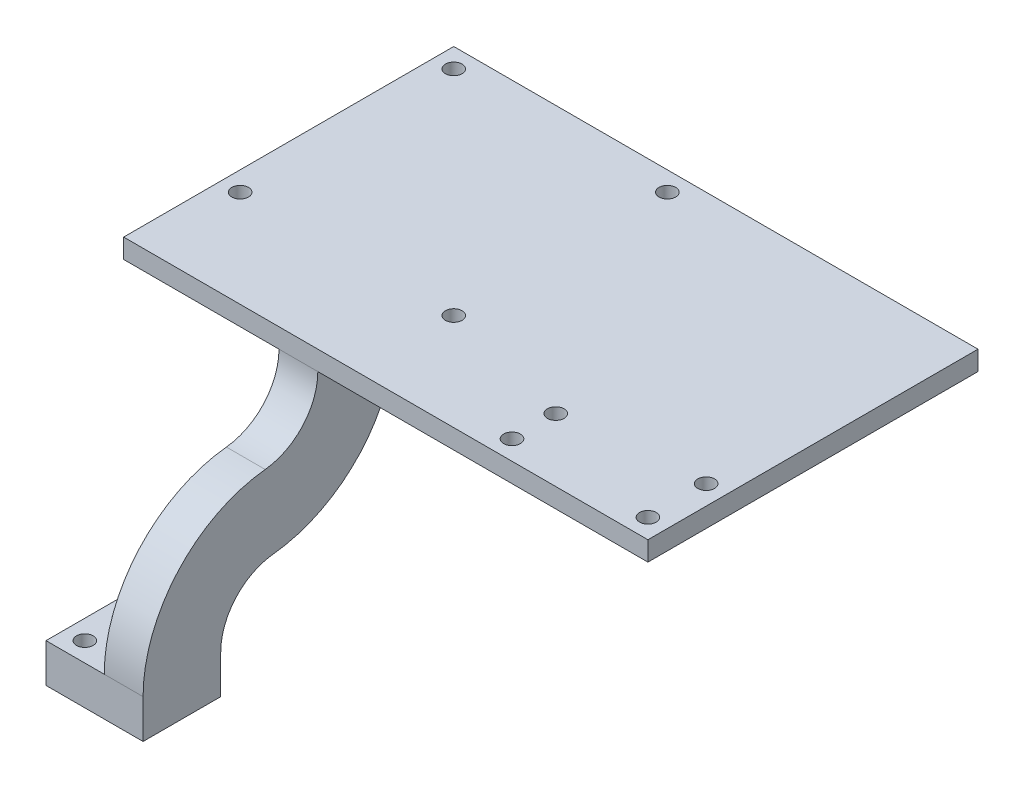
ISO-10303-21;
HEADER;
FILE_DESCRIPTION(('STEP AP214'),'2;1');
FILE_NAME('part.step','',(''),(''),'','','');
FILE_SCHEMA(('AUTOMOTIVE_DESIGN { 1 0 10303 214 1 1 1 1 }'));
ENDSEC;
DATA;
#1=APPLICATION_CONTEXT('core data for automotive mechanical design processes');
#2=APPLICATION_PROTOCOL_DEFINITION('international standard','automotive_design',2000,#1);
#3=PRODUCT_CONTEXT('',#1,'mechanical');
#4=PRODUCT('Part','Part','',(#3));
#5=PRODUCT_RELATED_PRODUCT_CATEGORY('part','',(#4));
#6=PRODUCT_DEFINITION_FORMATION('','',#4);
#7=PRODUCT_DEFINITION_CONTEXT('part definition',#1,'design');
#8=PRODUCT_DEFINITION('design','',#6,#7);
#9=PRODUCT_DEFINITION_SHAPE('','',#8);
#10=(LENGTH_UNIT() NAMED_UNIT(*) SI_UNIT(.MILLI.,.METRE.));
#11=(NAMED_UNIT(*) PLANE_ANGLE_UNIT() SI_UNIT($,.RADIAN.));
#12=(NAMED_UNIT(*) SI_UNIT($,.STERADIAN.) SOLID_ANGLE_UNIT());
#13=UNCERTAINTY_MEASURE_WITH_UNIT(LENGTH_MEASURE(1.E-05),#10,'distance_accuracy_value','');
#14=(GEOMETRIC_REPRESENTATION_CONTEXT(3) GLOBAL_UNCERTAINTY_ASSIGNED_CONTEXT((#13)) GLOBAL_UNIT_ASSIGNED_CONTEXT((#10,
#11,#12)) REPRESENTATION_CONTEXT('',''));
#15=CARTESIAN_POINT('',(0.,0.,0.));
#16=DIRECTION('',(0.,0.,1.));
#17=DIRECTION('',(1.,0.,0.));
#18=AXIS2_PLACEMENT_3D('',#15,#16,#17);
#19=CARTESIAN_POINT('',(10.,-10.,10.));
#20=DIRECTION('',(0.,1.,0.));
#21=DIRECTION('',(0.,0.,1.));
#22=AXIS2_PLACEMENT_3D('',#19,#20,#21);
#23=PLANE('',#22);
#24=CARTESIAN_POINT('',(-10.,-10.,-5.));
#25=DIRECTION('',(0.,1.,0.));
#26=DIRECTION('',(0.,0.,1.));
#27=AXIS2_PLACEMENT_3D('',#24,#25,#26);
#28=CIRCLE('',#27,2.15265);
#29=CARTESIAN_POINT('',(-10.,-10.,-2.84735));
#30=VERTEX_POINT('',#29);
#31=EDGE_CURVE('E234',#30,#30,#28,.T.);
#32=ORIENTED_EDGE('',*,*,#31,.T.);
#33=EDGE_LOOP('',(#32));
#34=FACE_BOUND('',#33,.T.);
#35=CARTESIAN_POINT('',(-10.,-10.,5.));
#36=DIRECTION('',(0.,1.,0.));
#37=DIRECTION('',(0.,0.,1.));
#38=AXIS2_PLACEMENT_3D('',#35,#36,#37);
#39=CIRCLE('',#38,2.15265);
#40=CARTESIAN_POINT('',(-10.,-10.,7.15265));
#41=VERTEX_POINT('',#40);
#42=EDGE_CURVE('E168',#41,#41,#39,.T.);
#43=ORIENTED_EDGE('',*,*,#42,.T.);
#44=EDGE_LOOP('',(#43));
#45=FACE_BOUND('',#44,.T.);
#46=DIRECTION('',(-1.,0.,0.));
#47=VECTOR('',#46,1.);
#48=CARTESIAN_POINT('',(10.,-10.,10.));
#49=LINE('',#48,#47);
#50=CARTESIAN_POINT('',(10.,-10.,10.));
#51=VERTEX_POINT('',#50);
#52=CARTESIAN_POINT('',(-15.,-10.,10.));
#53=VERTEX_POINT('',#52);
#54=EDGE_CURVE('E114',#51,#53,#49,.T.);
#55=ORIENTED_EDGE('',*,*,#54,.T.);
#56=DIRECTION('',(0.,0.,-1.));
#57=VECTOR('',#56,1.);
#58=CARTESIAN_POINT('',(-15.,-10.,10.));
#59=LINE('',#58,#57);
#60=CARTESIAN_POINT('',(-15.,-10.,-10.));
#61=VERTEX_POINT('',#60);
#62=EDGE_CURVE('E161',#53,#61,#59,.T.);
#63=ORIENTED_EDGE('',*,*,#62,.T.);
#64=DIRECTION('',(-1.,0.,0.));
#65=VECTOR('',#64,1.);
#66=CARTESIAN_POINT('',(10.,-10.,-10.));
#67=LINE('',#66,#65);
#68=CARTESIAN_POINT('',(10.,-10.,-10.));
#69=VERTEX_POINT('',#68);
#70=EDGE_CURVE('E45',#69,#61,#67,.T.);
#71=ORIENTED_EDGE('',*,*,#70,.F.);
#72=DIRECTION('',(0.,0.,-1.));
#73=VECTOR('',#72,1.);
#74=CARTESIAN_POINT('',(10.,-10.,10.));
#75=LINE('',#74,#73);
#76=EDGE_CURVE('E130',#51,#69,#75,.T.);
#77=ORIENTED_EDGE('',*,*,#76,.F.);
#78=EDGE_LOOP('',(#55,#63,#71,#77));
#79=FACE_BOUND('',#78,.T.);
#80=ADVANCED_FACE('F37',(#34,#45,#79),#23,.F.);
#81=CARTESIAN_POINT('',(10.,-10.,-10.));
#82=DIRECTION('',(0.,0.,1.));
#83=DIRECTION('',(0.,-1.,0.));
#84=AXIS2_PLACEMENT_3D('',#81,#82,#83);
#85=PLANE('',#84);
#86=ORIENTED_EDGE('',*,*,#70,.T.);
#87=DIRECTION('',(0.,1.,0.));
#88=VECTOR('',#87,1.);
#89=CARTESIAN_POINT('',(-15.,-10.,-10.));
#90=LINE('',#89,#88);
#91=CARTESIAN_POINT('',(-15.,0.,-10.));
#92=VERTEX_POINT('',#91);
#93=EDGE_CURVE('E150',#61,#92,#90,.T.);
#94=ORIENTED_EDGE('',*,*,#93,.T.);
#95=DIRECTION('',(1.,0.,0.));
#96=VECTOR('',#95,1.);
#97=CARTESIAN_POINT('',(-15.,0.,-10.));
#98=LINE('',#97,#96);
#99=CARTESIAN_POINT('',(0.,0.,-10.));
#100=VERTEX_POINT('',#99);
#101=EDGE_CURVE('E173',#92,#100,#98,.T.);
#102=ORIENTED_EDGE('',*,*,#101,.T.);
#103=DIRECTION('',(-1.,0.,0.));
#104=VECTOR('',#103,1.);
#105=CARTESIAN_POINT('',(10.,0.,-10.));
#106=LINE('',#105,#104);
#107=CARTESIAN_POINT('',(10.,0.,-10.));
#108=VERTEX_POINT('',#107);
#109=EDGE_CURVE('E141',#108,#100,#106,.T.);
#110=ORIENTED_EDGE('',*,*,#109,.F.);
#111=DIRECTION('',(0.,1.,0.));
#112=VECTOR('',#111,1.);
#113=CARTESIAN_POINT('',(10.,-10.,-10.));
#114=LINE('',#113,#112);
#115=EDGE_CURVE('E81',#69,#108,#114,.T.);
#116=ORIENTED_EDGE('',*,*,#115,.F.);
#117=EDGE_LOOP('',(#86,#94,#102,#110,#116));
#118=FACE_BOUND('',#117,.T.);
#119=ADVANCED_FACE('F147',(#118),#85,.F.);
#120=CARTESIAN_POINT('',(10.,0.,-25.1388888888889));
#121=DIRECTION('',(-1.,0.,0.));
#122=DIRECTION('',(0.,0.,1.));
#123=AXIS2_PLACEMENT_3D('',#120,#121,#122);
#124=CYLINDRICAL_SURFACE('',#123,15.1388888888889);
#125=CARTESIAN_POINT('',(0.,0.,-25.1388888888889));
#126=DIRECTION('',(-1.,0.,0.));
#127=DIRECTION('',(0.,0.,1.));
#128=AXIS2_PLACEMENT_3D('',#125,#126,#127);
#129=CIRCLE('',#128,15.1388888888889);
#130=CARTESIAN_POINT('',(0.,15.0552486187845,-23.5497237569061));
#131=VERTEX_POINT('',#130);
#132=EDGE_CURVE('E118',#100,#131,#129,.T.);
#133=ORIENTED_EDGE('',*,*,#132,.T.);
#134=DIRECTION('',(-1.,0.,0.));
#135=VECTOR('',#134,1.);
#136=CARTESIAN_POINT('',(10.,15.0552486187845,-23.5497237569061));
#137=LINE('',#136,#135);
#138=CARTESIAN_POINT('',(10.,15.0552486187845,-23.5497237569061));
#139=VERTEX_POINT('',#138);
#140=EDGE_CURVE('E138',#139,#131,#137,.T.);
#141=ORIENTED_EDGE('',*,*,#140,.F.);
#142=CARTESIAN_POINT('',(10.,0.,-25.1388888888889));
#143=DIRECTION('',(-1.,0.,0.));
#144=DIRECTION('',(0.,0.,1.));
#145=AXIS2_PLACEMENT_3D('',#142,#143,#144);
#146=CIRCLE('',#145,15.1388888888889);
#147=EDGE_CURVE('E179',#108,#139,#146,.T.);
#148=ORIENTED_EDGE('',*,*,#147,.F.);
#149=ORIENTED_EDGE('',*,*,#109,.T.);
#150=EDGE_LOOP('',(#133,#141,#148,#149));
#151=FACE_BOUND('',#150,.T.);
#152=ADVANCED_FACE('F266',(#151),#124,.F.);
#153=CARTESIAN_POINT('',(10.,50.,-19.8611111111111));
#154=DIRECTION('',(-1.,0.,0.));
#155=DIRECTION('',(0.,0.,1.));
#156=AXIS2_PLACEMENT_3D('',#153,#154,#155);
#157=CYLINDRICAL_SURFACE('',#156,35.1388888888889);
#158=CARTESIAN_POINT('',(0.,50.,-19.8611111111111));
#159=DIRECTION('',(1.,0.,0.));
#160=DIRECTION('',(0.,0.,-1.));
#161=AXIS2_PLACEMENT_3D('',#158,#159,#160);
#162=CIRCLE('',#161,35.1388888888889);
#163=CARTESIAN_POINT('',(0.,50.,-55.));
#164=VERTEX_POINT('',#163);
#165=EDGE_CURVE('E120',#131,#164,#162,.T.);
#166=ORIENTED_EDGE('',*,*,#165,.T.);
#167=DIRECTION('',(-1.,0.,0.));
#168=VECTOR('',#167,1.);
#169=CARTESIAN_POINT('',(10.,50.,-55.));
#170=LINE('',#169,#168);
#171=CARTESIAN_POINT('',(10.,50.,-55.));
#172=VERTEX_POINT('',#171);
#173=EDGE_CURVE('E135',#172,#164,#170,.T.);
#174=ORIENTED_EDGE('',*,*,#173,.F.);
#175=CARTESIAN_POINT('',(10.,50.,-19.8611111111111));
#176=DIRECTION('',(1.,0.,0.));
#177=DIRECTION('',(0.,0.,-1.));
#178=AXIS2_PLACEMENT_3D('',#175,#176,#177);
#179=CIRCLE('',#178,35.1388888888889);
#180=EDGE_CURVE('E181',#139,#172,#179,.T.);
#181=ORIENTED_EDGE('',*,*,#180,.F.);
#182=ORIENTED_EDGE('',*,*,#140,.T.);
#183=EDGE_LOOP('',(#166,#174,#181,#182));
#184=FACE_BOUND('',#183,.T.);
#185=ADVANCED_FACE('F187',(#184),#157,.T.);
#186=CARTESIAN_POINT('',(10.,50.,-19.8611111111111));
#187=DIRECTION('',(-1.,0.,0.));
#188=DIRECTION('',(0.,0.,1.));
#189=AXIS2_PLACEMENT_3D('',#186,#187,#188);
#190=CYLINDRICAL_SURFACE('',#189,15.1388888888889);
#191=CARTESIAN_POINT('',(0.,50.,-19.8611111111111));
#192=DIRECTION('',(-1.,0.,0.));
#193=DIRECTION('',(0.,0.,-1.));
#194=AXIS2_PLACEMENT_3D('',#191,#192,#193);
#195=CIRCLE('',#194,15.1388888888889);
#196=CARTESIAN_POINT('',(0.,50.,-35.));
#197=VERTEX_POINT('',#196);
#198=CARTESIAN_POINT('',(0.,34.9447513812155,-21.4502762430939));
#199=VERTEX_POINT('',#198);
#200=EDGE_CURVE('E72',#197,#199,#195,.T.);
#201=ORIENTED_EDGE('',*,*,#200,.T.);
#202=DIRECTION('',(-1.,0.,0.));
#203=VECTOR('',#202,1.);
#204=CARTESIAN_POINT('',(10.,34.9447513812155,-21.4502762430939));
#205=LINE('',#204,#203);
#206=CARTESIAN_POINT('',(10.,34.9447513812155,-21.4502762430939));
#207=VERTEX_POINT('',#206);
#208=EDGE_CURVE('E104',#207,#199,#205,.T.);
#209=ORIENTED_EDGE('',*,*,#208,.F.);
#210=CARTESIAN_POINT('',(10.,50.,-19.8611111111111));
#211=DIRECTION('',(-1.,0.,0.));
#212=DIRECTION('',(0.,0.,-1.));
#213=AXIS2_PLACEMENT_3D('',#210,#211,#212);
#214=CIRCLE('',#213,15.1388888888889);
#215=CARTESIAN_POINT('',(10.,50.,-35.));
#216=VERTEX_POINT('',#215);
#217=EDGE_CURVE('E95',#216,#207,#214,.T.);
#218=ORIENTED_EDGE('',*,*,#217,.F.);
#219=DIRECTION('',(-1.,0.,0.));
#220=VECTOR('',#219,1.);
#221=CARTESIAN_POINT('',(10.,50.,-35.));
#222=LINE('',#221,#220);
#223=EDGE_CURVE('E68',#216,#197,#222,.T.);
#224=ORIENTED_EDGE('',*,*,#223,.T.);
#225=EDGE_LOOP('',(#201,#209,#218,#224));
#226=FACE_BOUND('',#225,.T.);
#227=ADVANCED_FACE('F105',(#226),#190,.F.);
#228=CARTESIAN_POINT('',(10.,0.,-25.1388888888889));
#229=DIRECTION('',(-1.,0.,0.));
#230=DIRECTION('',(0.,0.,1.));
#231=AXIS2_PLACEMENT_3D('',#228,#229,#230);
#232=CYLINDRICAL_SURFACE('',#231,35.1388888888889);
#233=CARTESIAN_POINT('',(0.,0.,-25.1388888888889));
#234=DIRECTION('',(1.,0.,0.));
#235=DIRECTION('',(0.,0.,1.));
#236=AXIS2_PLACEMENT_3D('',#233,#234,#235);
#237=CIRCLE('',#236,35.1388888888889);
#238=CARTESIAN_POINT('',(0.,0.,10.));
#239=VERTEX_POINT('',#238);
#240=EDGE_CURVE('E128',#199,#239,#237,.T.);
#241=ORIENTED_EDGE('',*,*,#240,.T.);
#242=DIRECTION('',(-1.,0.,0.));
#243=VECTOR('',#242,1.);
#244=CARTESIAN_POINT('',(10.,0.,10.));
#245=LINE('',#244,#243);
#246=CARTESIAN_POINT('',(10.,0.,10.));
#247=VERTEX_POINT('',#246);
#248=EDGE_CURVE('E109',#247,#239,#245,.T.);
#249=ORIENTED_EDGE('',*,*,#248,.F.);
#250=CARTESIAN_POINT('',(10.,0.,-25.1388888888889));
#251=DIRECTION('',(1.,0.,0.));
#252=DIRECTION('',(0.,0.,1.));
#253=AXIS2_PLACEMENT_3D('',#250,#251,#252);
#254=CIRCLE('',#253,35.1388888888889);
#255=EDGE_CURVE('E98',#207,#247,#254,.T.);
#256=ORIENTED_EDGE('',*,*,#255,.F.);
#257=ORIENTED_EDGE('',*,*,#208,.T.);
#258=EDGE_LOOP('',(#241,#249,#256,#257));
#259=FACE_BOUND('',#258,.T.);
#260=ADVANCED_FACE('F111',(#259),#232,.T.);
#261=CARTESIAN_POINT('',(10.,0.,10.));
#262=DIRECTION('',(0.,0.,-1.));
#263=DIRECTION('',(-1.,0.,0.));
#264=AXIS2_PLACEMENT_3D('',#261,#262,#263);
#265=PLANE('',#264);
#266=ORIENTED_EDGE('',*,*,#248,.T.);
#267=DIRECTION('',(1.,0.,0.));
#268=VECTOR('',#267,1.);
#269=CARTESIAN_POINT('',(-15.,0.,10.));
#270=LINE('',#269,#268);
#271=CARTESIAN_POINT('',(-15.,0.,10.));
#272=VERTEX_POINT('',#271);
#273=EDGE_CURVE('E121',#272,#239,#270,.T.);
#274=ORIENTED_EDGE('',*,*,#273,.F.);
#275=DIRECTION('',(0.,-1.,0.));
#276=VECTOR('',#275,1.);
#277=CARTESIAN_POINT('',(-15.,-10.,10.));
#278=LINE('',#277,#276);
#279=EDGE_CURVE('E166',#272,#53,#278,.T.);
#280=ORIENTED_EDGE('',*,*,#279,.T.);
#281=ORIENTED_EDGE('',*,*,#54,.F.);
#282=DIRECTION('',(0.,-1.,0.));
#283=VECTOR('',#282,1.);
#284=CARTESIAN_POINT('',(10.,0.,10.));
#285=LINE('',#284,#283);
#286=EDGE_CURVE('E53',#247,#51,#285,.T.);
#287=ORIENTED_EDGE('',*,*,#286,.F.);
#288=EDGE_LOOP('',(#266,#274,#280,#281,#287));
#289=FACE_BOUND('',#288,.T.);
#290=ADVANCED_FACE('F264',(#289),#265,.F.);
#291=CARTESIAN_POINT('',(10.,0.,-25.1388888888889));
#292=DIRECTION('',(-1.,0.,0.));
#293=DIRECTION('',(0.,0.,1.));
#294=AXIS2_PLACEMENT_3D('',#291,#292,#293);
#295=PLANE('',#294);
#296=ORIENTED_EDGE('',*,*,#255,.T.);
#297=ORIENTED_EDGE('',*,*,#286,.T.);
#298=ORIENTED_EDGE('',*,*,#76,.T.);
#299=ORIENTED_EDGE('',*,*,#115,.T.);
#300=ORIENTED_EDGE('',*,*,#147,.T.);
#301=ORIENTED_EDGE('',*,*,#180,.T.);
#302=DIRECTION('',(0.,0.,1.));
#303=VECTOR('',#302,1.);
#304=CARTESIAN_POINT('',(10.,50.,-55.));
#305=LINE('',#304,#303);
#306=EDGE_CURVE('E101',#172,#216,#305,.T.);
#307=ORIENTED_EDGE('',*,*,#306,.T.);
#308=ORIENTED_EDGE('',*,*,#217,.T.);
#309=EDGE_LOOP('',(#296,#297,#298,#299,#300,#301,#307,#308));
#310=FACE_BOUND('',#309,.T.);
#311=ADVANCED_FACE('F96',(#310),#295,.F.);
#312=CARTESIAN_POINT('',(0.,0.,-25.1388888888889));
#313=DIRECTION('',(-1.,0.,0.));
#314=DIRECTION('',(0.,0.,1.));
#315=AXIS2_PLACEMENT_3D('',#312,#313,#314);
#316=PLANE('',#315);
#317=DIRECTION('',(0.,0.,-1.));
#318=VECTOR('',#317,1.);
#319=CARTESIAN_POINT('',(0.,0.,-25.1388888888889));
#320=LINE('',#319,#318);
#321=EDGE_CURVE('E11',#239,#100,#320,.T.);
#322=ORIENTED_EDGE('',*,*,#321,.F.);
#323=ORIENTED_EDGE('',*,*,#240,.F.);
#324=ORIENTED_EDGE('',*,*,#200,.F.);
#325=DIRECTION('',(0.,0.,1.));
#326=VECTOR('',#325,1.);
#327=CARTESIAN_POINT('',(0.,50.,-55.));
#328=LINE('',#327,#326);
#329=EDGE_CURVE('E124',#164,#197,#328,.T.);
#330=ORIENTED_EDGE('',*,*,#329,.F.);
#331=ORIENTED_EDGE('',*,*,#165,.F.);
#332=ORIENTED_EDGE('',*,*,#132,.F.);
#333=EDGE_LOOP('',(#322,#323,#324,#330,#331,#332));
#334=FACE_BOUND('',#333,.T.);
#335=ADVANCED_FACE('F253',(#334),#316,.T.);
#336=CARTESIAN_POINT('',(-15.,0.,10.));
#337=DIRECTION('',(0.,1.,0.));
#338=DIRECTION('',(0.,0.,1.));
#339=AXIS2_PLACEMENT_3D('',#336,#337,#338);
#340=PLANE('',#339);
#341=CARTESIAN_POINT('',(-10.,0.,-5.));
#342=DIRECTION('',(0.,1.,0.));
#343=DIRECTION('',(0.,0.,1.));
#344=AXIS2_PLACEMENT_3D('',#341,#342,#343);
#345=CIRCLE('',#344,2.15264999999999);
#346=CARTESIAN_POINT('',(-10.,0.,-2.84735000000001));
#347=VERTEX_POINT('',#346);
#348=EDGE_CURVE('E231',#347,#347,#345,.T.);
#349=ORIENTED_EDGE('',*,*,#348,.F.);
#350=EDGE_LOOP('',(#349));
#351=FACE_BOUND('',#350,.T.);
#352=CARTESIAN_POINT('',(-10.,0.,5.));
#353=DIRECTION('',(0.,1.,0.));
#354=DIRECTION('',(0.,0.,1.));
#355=AXIS2_PLACEMENT_3D('',#352,#353,#354);
#356=CIRCLE('',#355,2.15264999999999);
#357=CARTESIAN_POINT('',(-10.,0.,7.15264999999999));
#358=VERTEX_POINT('',#357);
#359=EDGE_CURVE('E237',#358,#358,#356,.T.);
#360=ORIENTED_EDGE('',*,*,#359,.F.);
#361=EDGE_LOOP('',(#360));
#362=FACE_BOUND('',#361,.T.);
#363=ORIENTED_EDGE('',*,*,#273,.T.);
#364=ORIENTED_EDGE('',*,*,#321,.T.);
#365=ORIENTED_EDGE('',*,*,#101,.F.);
#366=DIRECTION('',(0.,0.,1.));
#367=VECTOR('',#366,1.);
#368=CARTESIAN_POINT('',(-15.,0.,10.));
#369=LINE('',#368,#367);
#370=EDGE_CURVE('E164',#92,#272,#369,.T.);
#371=ORIENTED_EDGE('',*,*,#370,.T.);
#372=EDGE_LOOP('',(#363,#364,#365,#371));
#373=FACE_BOUND('',#372,.T.);
#374=ADVANCED_FACE('F250',(#351,#362,#373),#340,.T.);
#375=CARTESIAN_POINT('',(-15.,0.,0.));
#376=DIRECTION('',(-1.,0.,0.));
#377=DIRECTION('',(0.,0.,1.));
#378=AXIS2_PLACEMENT_3D('',#375,#376,#377);
#379=PLANE('',#378);
#380=ORIENTED_EDGE('',*,*,#279,.F.);
#381=ORIENTED_EDGE('',*,*,#370,.F.);
#382=ORIENTED_EDGE('',*,*,#93,.F.);
#383=ORIENTED_EDGE('',*,*,#62,.F.);
#384=EDGE_LOOP('',(#380,#381,#382,#383));
#385=FACE_BOUND('',#384,.T.);
#386=ADVANCED_FACE('F160',(#385),#379,.T.);
#387=CARTESIAN_POINT('',(-10.,0.,5.));
#388=DIRECTION('',(0.,1.,0.));
#389=DIRECTION('',(0.,0.,1.));
#390=AXIS2_PLACEMENT_3D('',#387,#388,#389);
#391=CYLINDRICAL_SURFACE('',#390,2.15264999999999);
#392=ORIENTED_EDGE('',*,*,#42,.F.);
#393=EDGE_LOOP('',(#392));
#394=FACE_BOUND('',#393,.T.);
#395=ORIENTED_EDGE('',*,*,#359,.T.);
#396=EDGE_LOOP('',(#395));
#397=FACE_BOUND('',#396,.T.);
#398=ADVANCED_FACE('F243',(#394,#397),#391,.F.);
#399=CARTESIAN_POINT('',(-10.,0.,-5.));
#400=DIRECTION('',(0.,1.,0.));
#401=DIRECTION('',(0.,0.,1.));
#402=AXIS2_PLACEMENT_3D('',#399,#400,#401);
#403=CYLINDRICAL_SURFACE('',#402,2.15264999999999);
#404=ORIENTED_EDGE('',*,*,#31,.F.);
#405=EDGE_LOOP('',(#404));
#406=FACE_BOUND('',#405,.T.);
#407=ORIENTED_EDGE('',*,*,#348,.T.);
#408=EDGE_LOOP('',(#407));
#409=FACE_BOUND('',#408,.T.);
#410=ADVANCED_FACE('F246',(#406,#409),#403,.F.);
#411=CARTESIAN_POINT('',(0.,50.,0.));
#412=DIRECTION('',(0.,1.,0.));
#413=DIRECTION('',(0.,0.,1.));
#414=AXIS2_PLACEMENT_3D('',#411,#412,#413);
#415=PLANE('',#414);
#416=CARTESIAN_POINT('',(90.,50.,-40.));
#417=DIRECTION('',(0.,1.,0.));
#418=DIRECTION('',(0.,0.,1.));
#419=AXIS2_PLACEMENT_3D('',#416,#417,#418);
#420=CIRCLE('',#419,2.15265);
#421=CARTESIAN_POINT('',(90.,50.,-37.84735));
#422=VERTEX_POINT('',#421);
#423=EDGE_CURVE('E351',#422,#422,#420,.T.);
#424=ORIENTED_EDGE('',*,*,#423,.T.);
#425=EDGE_LOOP('',(#424));
#426=FACE_BOUND('',#425,.T.);
#427=CARTESIAN_POINT('',(55.,50.,-40.));
#428=DIRECTION('',(0.,1.,0.));
#429=DIRECTION('',(0.,0.,1.));
#430=AXIS2_PLACEMENT_3D('',#427,#428,#429);
#431=CIRCLE('',#430,2.15265);
#432=CARTESIAN_POINT('',(55.,50.,-37.84735));
#433=VERTEX_POINT('',#432);
#434=EDGE_CURVE('E345',#433,#433,#431,.T.);
#435=ORIENTED_EDGE('',*,*,#434,.T.);
#436=EDGE_LOOP('',(#435));
#437=FACE_BOUND('',#436,.T.);
#438=CARTESIAN_POINT('',(55.,50.,-51.2660634139274));
#439=DIRECTION('',(0.,1.,0.));
#440=DIRECTION('',(0.,0.,1.));
#441=AXIS2_PLACEMENT_3D('',#438,#439,#440);
#442=CIRCLE('',#441,2.15265);
#443=CARTESIAN_POINT('',(55.,50.,-49.1134134139274));
#444=VERTEX_POINT('',#443);
#445=EDGE_CURVE('E339',#444,#444,#442,.T.);
#446=ORIENTED_EDGE('',*,*,#445,.T.);
#447=EDGE_LOOP('',(#446));
#448=FACE_BOUND('',#447,.T.);
#449=CARTESIAN_POINT('',(90.,50.,-55.));
#450=DIRECTION('',(0.,1.,0.));
#451=DIRECTION('',(0.,0.,1.));
#452=AXIS2_PLACEMENT_3D('',#449,#450,#451);
#453=CIRCLE('',#452,2.15265);
#454=CARTESIAN_POINT('',(90.,50.,-52.84735));
#455=VERTEX_POINT('',#454);
#456=EDGE_CURVE('E333',#455,#455,#453,.T.);
#457=ORIENTED_EDGE('',*,*,#456,.T.);
#458=EDGE_LOOP('',(#457));
#459=FACE_BOUND('',#458,.T.);
#460=CARTESIAN_POINT('',(20.,50.,-115.));
#461=DIRECTION('',(0.,1.,0.));
#462=DIRECTION('',(0.,0.,1.));
#463=AXIS2_PLACEMENT_3D('',#460,#461,#462);
#464=CIRCLE('',#463,2.15265);
#465=CARTESIAN_POINT('',(20.,50.,-112.84735));
#466=VERTEX_POINT('',#465);
#467=EDGE_CURVE('E327',#466,#466,#464,.T.);
#468=ORIENTED_EDGE('',*,*,#467,.T.);
#469=EDGE_LOOP('',(#468));
#470=FACE_BOUND('',#469,.T.);
#471=CARTESIAN_POINT('',(20.,50.,-60.));
#472=DIRECTION('',(0.,1.,0.));
#473=DIRECTION('',(0.,0.,1.));
#474=AXIS2_PLACEMENT_3D('',#471,#472,#473);
#475=CIRCLE('',#474,2.15265);
#476=CARTESIAN_POINT('',(20.,50.,-57.84735));
#477=VERTEX_POINT('',#476);
#478=EDGE_CURVE('E321',#477,#477,#475,.T.);
#479=ORIENTED_EDGE('',*,*,#478,.T.);
#480=EDGE_LOOP('',(#479));
#481=FACE_BOUND('',#480,.T.);
#482=CARTESIAN_POINT('',(-35.,50.,-60.));
#483=DIRECTION('',(0.,1.,0.));
#484=DIRECTION('',(0.,0.,1.));
#485=AXIS2_PLACEMENT_3D('',#482,#483,#484);
#486=CIRCLE('',#485,2.15265);
#487=CARTESIAN_POINT('',(-35.,50.,-57.84735));
#488=VERTEX_POINT('',#487);
#489=EDGE_CURVE('E315',#488,#488,#486,.T.);
#490=ORIENTED_EDGE('',*,*,#489,.T.);
#491=EDGE_LOOP('',(#490));
#492=FACE_BOUND('',#491,.T.);
#493=CARTESIAN_POINT('',(-35.,50.,-115.));
#494=DIRECTION('',(0.,1.,0.));
#495=DIRECTION('',(0.,0.,1.));
#496=AXIS2_PLACEMENT_3D('',#493,#494,#495);
#497=CIRCLE('',#496,2.15265);
#498=CARTESIAN_POINT('',(-35.,50.,-112.84735));
#499=VERTEX_POINT('',#498);
#500=EDGE_CURVE('E305',#499,#499,#497,.T.);
#501=ORIENTED_EDGE('',*,*,#500,.T.);
#502=EDGE_LOOP('',(#501));
#503=FACE_BOUND('',#502,.T.);
#504=ORIENTED_EDGE('',*,*,#173,.T.);
#505=ORIENTED_EDGE('',*,*,#329,.T.);
#506=DIRECTION('',(1.,0.,0.));
#507=VECTOR('',#506,1.);
#508=CARTESIAN_POINT('',(95.,50.,-35.));
#509=LINE('',#508,#507);
#510=CARTESIAN_POINT('',(-40.,50.,-35.));
#511=VERTEX_POINT('',#510);
#512=EDGE_CURVE('E202',#511,#197,#509,.T.);
#513=ORIENTED_EDGE('',*,*,#512,.F.);
#514=DIRECTION('',(0.,0.,1.));
#515=VECTOR('',#514,1.);
#516=CARTESIAN_POINT('',(-40.,50.,-35.));
#517=LINE('',#516,#515);
#518=CARTESIAN_POINT('',(-40.,50.,-120.));
#519=VERTEX_POINT('',#518);
#520=EDGE_CURVE('E203',#519,#511,#517,.T.);
#521=ORIENTED_EDGE('',*,*,#520,.F.);
#522=DIRECTION('',(-1.,0.,0.));
#523=VECTOR('',#522,1.);
#524=CARTESIAN_POINT('',(95.,50.,-120.));
#525=LINE('',#524,#523);
#526=CARTESIAN_POINT('',(95.,50.,-120.));
#527=VERTEX_POINT('',#526);
#528=EDGE_CURVE('E304',#527,#519,#525,.T.);
#529=ORIENTED_EDGE('',*,*,#528,.F.);
#530=DIRECTION('',(0.,0.,-1.));
#531=VECTOR('',#530,1.);
#532=CARTESIAN_POINT('',(95.,50.,-35.));
#533=LINE('',#532,#531);
#534=CARTESIAN_POINT('',(95.,50.,-35.));
#535=VERTEX_POINT('',#534);
#536=EDGE_CURVE('E198',#535,#527,#533,.T.);
#537=ORIENTED_EDGE('',*,*,#536,.F.);
#538=EDGE_CURVE('E194',#216,#535,#509,.T.);
#539=ORIENTED_EDGE('',*,*,#538,.F.);
#540=ORIENTED_EDGE('',*,*,#306,.F.);
#541=EDGE_LOOP('',(#504,#505,#513,#521,#529,#537,#539,#540));
#542=FACE_BOUND('',#541,.T.);
#543=ADVANCED_FACE('F191',(#426,#437,#448,#459,#470,#481,#492,#503,#542),#415,.F.);
#544=CARTESIAN_POINT('',(95.,55.,-35.));
#545=DIRECTION('',(-1.,0.,0.));
#546=DIRECTION('',(0.,0.,1.));
#547=AXIS2_PLACEMENT_3D('',#544,#545,#546);
#548=PLANE('',#547);
#549=ORIENTED_EDGE('',*,*,#536,.T.);
#550=DIRECTION('',(0.,-1.,0.));
#551=VECTOR('',#550,1.);
#552=CARTESIAN_POINT('',(95.,55.,-120.));
#553=LINE('',#552,#551);
#554=CARTESIAN_POINT('',(95.,55.,-120.));
#555=VERTEX_POINT('',#554);
#556=EDGE_CURVE('E228',#555,#527,#553,.T.);
#557=ORIENTED_EDGE('',*,*,#556,.F.);
#558=DIRECTION('',(0.,0.,-1.));
#559=VECTOR('',#558,1.);
#560=CARTESIAN_POINT('',(95.,55.,-35.));
#561=LINE('',#560,#559);
#562=CARTESIAN_POINT('',(95.,55.,-35.));
#563=VERTEX_POINT('',#562);
#564=EDGE_CURVE('E214',#563,#555,#561,.T.);
#565=ORIENTED_EDGE('',*,*,#564,.F.);
#566=DIRECTION('',(0.,-1.,0.));
#567=VECTOR('',#566,1.);
#568=CARTESIAN_POINT('',(95.,55.,-35.));
#569=LINE('',#568,#567);
#570=EDGE_CURVE('E221',#563,#535,#569,.T.);
#571=ORIENTED_EDGE('',*,*,#570,.T.);
#572=EDGE_LOOP('',(#549,#557,#565,#571));
#573=FACE_BOUND('',#572,.T.);
#574=ADVANCED_FACE('F303',(#573),#548,.F.);
#575=CARTESIAN_POINT('',(95.,55.,-120.));
#576=DIRECTION('',(0.,0.,1.));
#577=DIRECTION('',(1.,0.,0.));
#578=AXIS2_PLACEMENT_3D('',#575,#576,#577);
#579=PLANE('',#578);
#580=ORIENTED_EDGE('',*,*,#528,.T.);
#581=DIRECTION('',(0.,-1.,0.));
#582=VECTOR('',#581,1.);
#583=CARTESIAN_POINT('',(-40.,55.,-120.));
#584=LINE('',#583,#582);
#585=CARTESIAN_POINT('',(-40.,55.,-120.));
#586=VERTEX_POINT('',#585);
#587=EDGE_CURVE('E225',#586,#519,#584,.T.);
#588=ORIENTED_EDGE('',*,*,#587,.F.);
#589=DIRECTION('',(-1.,0.,0.));
#590=VECTOR('',#589,1.);
#591=CARTESIAN_POINT('',(95.,55.,-120.));
#592=LINE('',#591,#590);
#593=EDGE_CURVE('E216',#555,#586,#592,.T.);
#594=ORIENTED_EDGE('',*,*,#593,.F.);
#595=ORIENTED_EDGE('',*,*,#556,.T.);
#596=EDGE_LOOP('',(#580,#588,#594,#595));
#597=FACE_BOUND('',#596,.T.);
#598=ADVANCED_FACE('F294',(#597),#579,.F.);
#599=CARTESIAN_POINT('',(-40.,55.,-35.));
#600=DIRECTION('',(1.,0.,0.));
#601=DIRECTION('',(0.,0.,-1.));
#602=AXIS2_PLACEMENT_3D('',#599,#600,#601);
#603=PLANE('',#602);
#604=ORIENTED_EDGE('',*,*,#520,.T.);
#605=DIRECTION('',(0.,-1.,0.));
#606=VECTOR('',#605,1.);
#607=CARTESIAN_POINT('',(-40.,55.,-35.));
#608=LINE('',#607,#606);
#609=CARTESIAN_POINT('',(-40.,55.,-35.));
#610=VERTEX_POINT('',#609);
#611=EDGE_CURVE('E212',#610,#511,#608,.T.);
#612=ORIENTED_EDGE('',*,*,#611,.F.);
#613=DIRECTION('',(0.,0.,1.));
#614=VECTOR('',#613,1.);
#615=CARTESIAN_POINT('',(-40.,55.,-35.));
#616=LINE('',#615,#614);
#617=EDGE_CURVE('E298',#586,#610,#616,.T.);
#618=ORIENTED_EDGE('',*,*,#617,.F.);
#619=ORIENTED_EDGE('',*,*,#587,.T.);
#620=EDGE_LOOP('',(#604,#612,#618,#619));
#621=FACE_BOUND('',#620,.T.);
#622=ADVANCED_FACE('F426',(#621),#603,.F.);
#623=CARTESIAN_POINT('',(95.,55.,-35.));
#624=DIRECTION('',(0.,0.,-1.));
#625=DIRECTION('',(-1.,0.,0.));
#626=AXIS2_PLACEMENT_3D('',#623,#624,#625);
#627=PLANE('',#626);
#628=ORIENTED_EDGE('',*,*,#512,.T.);
#629=ORIENTED_EDGE('',*,*,#223,.F.);
#630=ORIENTED_EDGE('',*,*,#538,.T.);
#631=ORIENTED_EDGE('',*,*,#570,.F.);
#632=DIRECTION('',(1.,0.,0.));
#633=VECTOR('',#632,1.);
#634=CARTESIAN_POINT('',(95.,55.,-35.));
#635=LINE('',#634,#633);
#636=EDGE_CURVE('E223',#610,#563,#635,.T.);
#637=ORIENTED_EDGE('',*,*,#636,.F.);
#638=ORIENTED_EDGE('',*,*,#611,.T.);
#639=EDGE_LOOP('',(#628,#629,#630,#631,#637,#638));
#640=FACE_BOUND('',#639,.T.);
#641=ADVANCED_FACE('F206',(#640),#627,.F.);
#642=CARTESIAN_POINT('',(0.,55.,0.));
#643=DIRECTION('',(0.,1.,0.));
#644=DIRECTION('',(0.,0.,1.));
#645=AXIS2_PLACEMENT_3D('',#642,#643,#644);
#646=PLANE('',#645);
#647=CARTESIAN_POINT('',(90.,55.,-40.));
#648=DIRECTION('',(0.,1.,0.));
#649=DIRECTION('',(0.,0.,1.));
#650=AXIS2_PLACEMENT_3D('',#647,#648,#649);
#651=CIRCLE('',#650,2.15265000000001);
#652=CARTESIAN_POINT('',(90.,55.,-37.84735));
#653=VERTEX_POINT('',#652);
#654=EDGE_CURVE('E354',#653,#653,#651,.T.);
#655=ORIENTED_EDGE('',*,*,#654,.F.);
#656=EDGE_LOOP('',(#655));
#657=FACE_BOUND('',#656,.T.);
#658=CARTESIAN_POINT('',(55.,55.,-40.));
#659=DIRECTION('',(0.,1.,0.));
#660=DIRECTION('',(0.,0.,1.));
#661=AXIS2_PLACEMENT_3D('',#658,#659,#660);
#662=CIRCLE('',#661,2.15265);
#663=CARTESIAN_POINT('',(55.,55.,-37.84735));
#664=VERTEX_POINT('',#663);
#665=EDGE_CURVE('E348',#664,#664,#662,.T.);
#666=ORIENTED_EDGE('',*,*,#665,.F.);
#667=EDGE_LOOP('',(#666));
#668=FACE_BOUND('',#667,.T.);
#669=CARTESIAN_POINT('',(55.,55.,-51.2660634139274));
#670=DIRECTION('',(0.,1.,0.));
#671=DIRECTION('',(0.,0.,1.));
#672=AXIS2_PLACEMENT_3D('',#669,#670,#671);
#673=CIRCLE('',#672,2.15265);
#674=CARTESIAN_POINT('',(55.,55.,-49.1134134139274));
#675=VERTEX_POINT('',#674);
#676=EDGE_CURVE('E342',#675,#675,#673,.T.);
#677=ORIENTED_EDGE('',*,*,#676,.F.);
#678=EDGE_LOOP('',(#677));
#679=FACE_BOUND('',#678,.T.);
#680=CARTESIAN_POINT('',(90.,55.,-55.));
#681=DIRECTION('',(0.,1.,0.));
#682=DIRECTION('',(0.,0.,1.));
#683=AXIS2_PLACEMENT_3D('',#680,#681,#682);
#684=CIRCLE('',#683,2.15265000000001);
#685=CARTESIAN_POINT('',(90.,55.,-52.84735));
#686=VERTEX_POINT('',#685);
#687=EDGE_CURVE('E336',#686,#686,#684,.T.);
#688=ORIENTED_EDGE('',*,*,#687,.F.);
#689=EDGE_LOOP('',(#688));
#690=FACE_BOUND('',#689,.T.);
#691=CARTESIAN_POINT('',(20.,55.,-115.));
#692=DIRECTION('',(0.,1.,0.));
#693=DIRECTION('',(0.,0.,1.));
#694=AXIS2_PLACEMENT_3D('',#691,#692,#693);
#695=CIRCLE('',#694,2.15265);
#696=CARTESIAN_POINT('',(20.,55.,-112.84735));
#697=VERTEX_POINT('',#696);
#698=EDGE_CURVE('E330',#697,#697,#695,.T.);
#699=ORIENTED_EDGE('',*,*,#698,.F.);
#700=EDGE_LOOP('',(#699));
#701=FACE_BOUND('',#700,.T.);
#702=CARTESIAN_POINT('',(20.,55.,-60.));
#703=DIRECTION('',(0.,1.,0.));
#704=DIRECTION('',(0.,0.,1.));
#705=AXIS2_PLACEMENT_3D('',#702,#703,#704);
#706=CIRCLE('',#705,2.15265);
#707=CARTESIAN_POINT('',(20.,55.,-57.84735));
#708=VERTEX_POINT('',#707);
#709=EDGE_CURVE('E324',#708,#708,#706,.T.);
#710=ORIENTED_EDGE('',*,*,#709,.F.);
#711=EDGE_LOOP('',(#710));
#712=FACE_BOUND('',#711,.T.);
#713=CARTESIAN_POINT('',(-35.,55.,-60.));
#714=DIRECTION('',(0.,1.,0.));
#715=DIRECTION('',(0.,0.,1.));
#716=AXIS2_PLACEMENT_3D('',#713,#714,#715);
#717=CIRCLE('',#716,2.15265);
#718=CARTESIAN_POINT('',(-35.,55.,-57.84735));
#719=VERTEX_POINT('',#718);
#720=EDGE_CURVE('E318',#719,#719,#717,.T.);
#721=ORIENTED_EDGE('',*,*,#720,.F.);
#722=EDGE_LOOP('',(#721));
#723=FACE_BOUND('',#722,.T.);
#724=CARTESIAN_POINT('',(-35.,55.,-115.));
#725=DIRECTION('',(0.,1.,0.));
#726=DIRECTION('',(0.,0.,1.));
#727=AXIS2_PLACEMENT_3D('',#724,#725,#726);
#728=CIRCLE('',#727,2.15265);
#729=CARTESIAN_POINT('',(-35.,55.,-112.84735));
#730=VERTEX_POINT('',#729);
#731=EDGE_CURVE('E308',#730,#730,#728,.T.);
#732=ORIENTED_EDGE('',*,*,#731,.F.);
#733=EDGE_LOOP('',(#732));
#734=FACE_BOUND('',#733,.T.);
#735=ORIENTED_EDGE('',*,*,#564,.T.);
#736=ORIENTED_EDGE('',*,*,#593,.T.);
#737=ORIENTED_EDGE('',*,*,#617,.T.);
#738=ORIENTED_EDGE('',*,*,#636,.T.);
#739=EDGE_LOOP('',(#735,#736,#737,#738));
#740=FACE_BOUND('',#739,.T.);
#741=ADVANCED_FACE('F301',(#657,#668,#679,#690,#701,#712,#723,#734,#740),#646,.T.);
#742=CARTESIAN_POINT('',(-35.,55.,-115.));
#743=DIRECTION('',(0.,1.,0.));
#744=DIRECTION('',(0.,0.,1.));
#745=AXIS2_PLACEMENT_3D('',#742,#743,#744);
#746=CYLINDRICAL_SURFACE('',#745,2.15265);
#747=ORIENTED_EDGE('',*,*,#731,.T.);
#748=EDGE_LOOP('',(#747));
#749=FACE_BOUND('',#748,.T.);
#750=ORIENTED_EDGE('',*,*,#500,.F.);
#751=EDGE_LOOP('',(#750));
#752=FACE_BOUND('',#751,.T.);
#753=ADVANCED_FACE('F363',(#749,#752),#746,.F.);
#754=CARTESIAN_POINT('',(-35.,55.,-60.));
#755=DIRECTION('',(0.,1.,0.));
#756=DIRECTION('',(0.,0.,1.));
#757=AXIS2_PLACEMENT_3D('',#754,#755,#756);
#758=CYLINDRICAL_SURFACE('',#757,2.15265);
#759=ORIENTED_EDGE('',*,*,#720,.T.);
#760=EDGE_LOOP('',(#759));
#761=FACE_BOUND('',#760,.T.);
#762=ORIENTED_EDGE('',*,*,#489,.F.);
#763=EDGE_LOOP('',(#762));
#764=FACE_BOUND('',#763,.T.);
#765=ADVANCED_FACE('F381',(#761,#764),#758,.F.);
#766=CARTESIAN_POINT('',(20.,55.,-60.));
#767=DIRECTION('',(0.,1.,0.));
#768=DIRECTION('',(0.,0.,1.));
#769=AXIS2_PLACEMENT_3D('',#766,#767,#768);
#770=CYLINDRICAL_SURFACE('',#769,2.15265);
#771=ORIENTED_EDGE('',*,*,#709,.T.);
#772=EDGE_LOOP('',(#771));
#773=FACE_BOUND('',#772,.T.);
#774=ORIENTED_EDGE('',*,*,#478,.F.);
#775=EDGE_LOOP('',(#774));
#776=FACE_BOUND('',#775,.T.);
#777=ADVANCED_FACE('F449',(#773,#776),#770,.F.);
#778=CARTESIAN_POINT('',(20.,55.,-115.));
#779=DIRECTION('',(0.,1.,0.));
#780=DIRECTION('',(0.,0.,1.));
#781=AXIS2_PLACEMENT_3D('',#778,#779,#780);
#782=CYLINDRICAL_SURFACE('',#781,2.15265);
#783=ORIENTED_EDGE('',*,*,#698,.T.);
#784=EDGE_LOOP('',(#783));
#785=FACE_BOUND('',#784,.T.);
#786=ORIENTED_EDGE('',*,*,#467,.F.);
#787=EDGE_LOOP('',(#786));
#788=FACE_BOUND('',#787,.T.);
#789=ADVANCED_FACE('F457',(#785,#788),#782,.F.);
#790=CARTESIAN_POINT('',(90.,55.,-55.));
#791=DIRECTION('',(0.,1.,0.));
#792=DIRECTION('',(0.,0.,1.));
#793=AXIS2_PLACEMENT_3D('',#790,#791,#792);
#794=CYLINDRICAL_SURFACE('',#793,2.15265);
#795=ORIENTED_EDGE('',*,*,#687,.T.);
#796=EDGE_LOOP('',(#795));
#797=FACE_BOUND('',#796,.T.);
#798=ORIENTED_EDGE('',*,*,#456,.F.);
#799=EDGE_LOOP('',(#798));
#800=FACE_BOUND('',#799,.T.);
#801=ADVANCED_FACE('F465',(#797,#800),#794,.F.);
#802=CARTESIAN_POINT('',(55.,55.,-51.2660634139274));
#803=DIRECTION('',(0.,1.,0.));
#804=DIRECTION('',(0.,0.,1.));
#805=AXIS2_PLACEMENT_3D('',#802,#803,#804);
#806=CYLINDRICAL_SURFACE('',#805,2.15265);
#807=ORIENTED_EDGE('',*,*,#676,.T.);
#808=EDGE_LOOP('',(#807));
#809=FACE_BOUND('',#808,.T.);
#810=ORIENTED_EDGE('',*,*,#445,.F.);
#811=EDGE_LOOP('',(#810));
#812=FACE_BOUND('',#811,.T.);
#813=ADVANCED_FACE('F472',(#809,#812),#806,.F.);
#814=CARTESIAN_POINT('',(55.,55.,-40.));
#815=DIRECTION('',(0.,1.,0.));
#816=DIRECTION('',(0.,0.,1.));
#817=AXIS2_PLACEMENT_3D('',#814,#815,#816);
#818=CYLINDRICAL_SURFACE('',#817,2.15265);
#819=ORIENTED_EDGE('',*,*,#665,.T.);
#820=EDGE_LOOP('',(#819));
#821=FACE_BOUND('',#820,.T.);
#822=ORIENTED_EDGE('',*,*,#434,.F.);
#823=EDGE_LOOP('',(#822));
#824=FACE_BOUND('',#823,.T.);
#825=ADVANCED_FACE('F480',(#821,#824),#818,.F.);
#826=CARTESIAN_POINT('',(90.,55.,-40.));
#827=DIRECTION('',(0.,1.,0.));
#828=DIRECTION('',(0.,0.,1.));
#829=AXIS2_PLACEMENT_3D('',#826,#827,#828);
#830=CYLINDRICAL_SURFACE('',#829,2.15265);
#831=ORIENTED_EDGE('',*,*,#654,.T.);
#832=EDGE_LOOP('',(#831));
#833=FACE_BOUND('',#832,.T.);
#834=ORIENTED_EDGE('',*,*,#423,.F.);
#835=EDGE_LOOP('',(#834));
#836=FACE_BOUND('',#835,.T.);
#837=ADVANCED_FACE('F358',(#833,#836),#830,.F.);
#838=CLOSED_SHELL('',(#80,#119,#152,#185,#227,#260,#290,#311,#335,#374,#386,#398,#410,#543,#574,
#598,#622,#641,#741,#753,#765,#777,#789,#801,#813,#825,#837));
#839=MANIFOLD_SOLID_BREP('B2',#838);
#840=ADVANCED_BREP_SHAPE_REPRESENTATION('',(#18,#839),#14);
#841=SHAPE_DEFINITION_REPRESENTATION(#9,#840);
ENDSEC;
END-ISO-10303-21;
